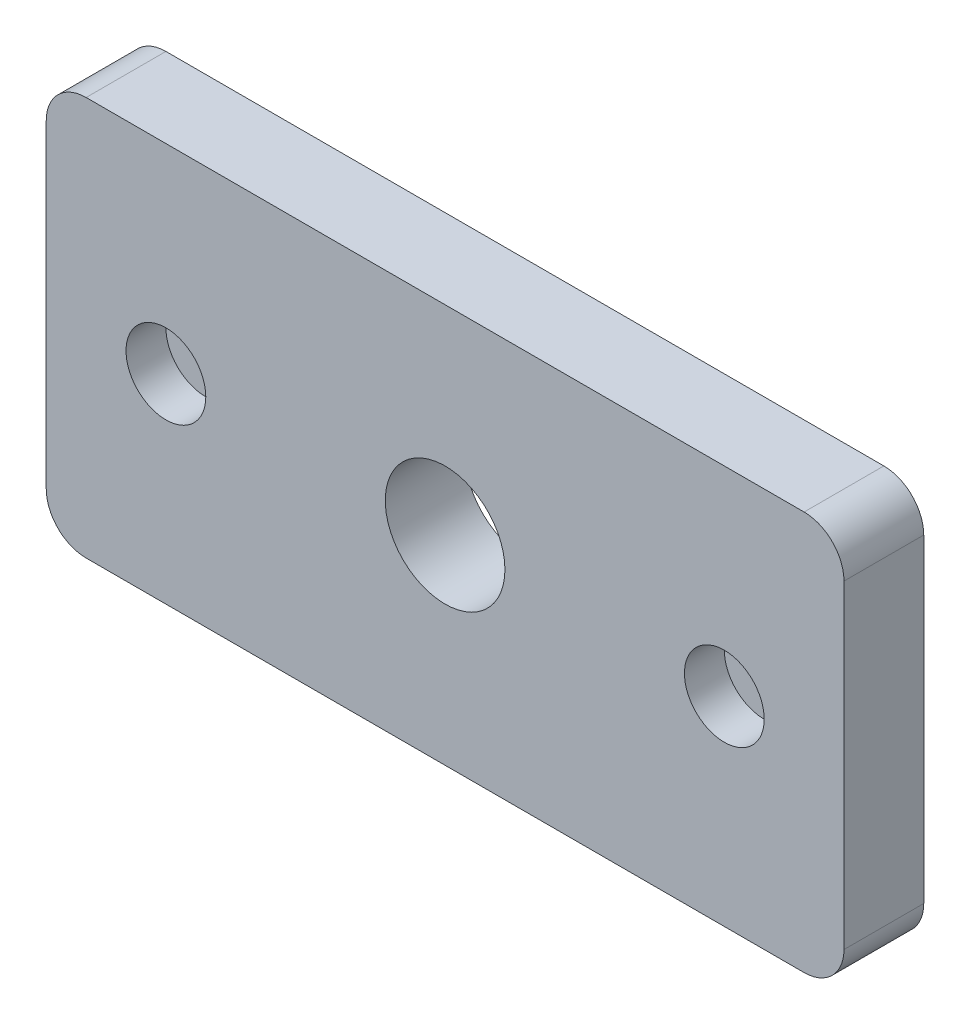
ISO-10303-21;
HEADER;
FILE_DESCRIPTION(('STEP AP214'),'2;1');
FILE_NAME('part.step','',(''),(''),'','','');
FILE_SCHEMA(('AUTOMOTIVE_DESIGN { 1 0 10303 214 1 1 1 1 }'));
ENDSEC;
DATA;
#1=APPLICATION_CONTEXT('core data for automotive mechanical design processes');
#2=APPLICATION_PROTOCOL_DEFINITION('international standard','automotive_design',2000,#1);
#3=PRODUCT_CONTEXT('',#1,'mechanical');
#4=PRODUCT('Part','Part','',(#3));
#5=PRODUCT_RELATED_PRODUCT_CATEGORY('part','',(#4));
#6=PRODUCT_DEFINITION_FORMATION('','',#4);
#7=PRODUCT_DEFINITION_CONTEXT('part definition',#1,'design');
#8=PRODUCT_DEFINITION('design','',#6,#7);
#9=PRODUCT_DEFINITION_SHAPE('','',#8);
#10=(LENGTH_UNIT() NAMED_UNIT(*) SI_UNIT(.MILLI.,.METRE.));
#11=(NAMED_UNIT(*) PLANE_ANGLE_UNIT() SI_UNIT($,.RADIAN.));
#12=(NAMED_UNIT(*) SI_UNIT($,.STERADIAN.) SOLID_ANGLE_UNIT());
#13=UNCERTAINTY_MEASURE_WITH_UNIT(LENGTH_MEASURE(1.E-05),#10,'distance_accuracy_value','');
#14=(GEOMETRIC_REPRESENTATION_CONTEXT(3) GLOBAL_UNCERTAINTY_ASSIGNED_CONTEXT((#13)) GLOBAL_UNIT_ASSIGNED_CONTEXT((#10,
#11,#12)) REPRESENTATION_CONTEXT('',''));
#15=CARTESIAN_POINT('',(0.,0.,0.));
#16=DIRECTION('',(0.,0.,1.));
#17=DIRECTION('',(1.,0.,0.));
#18=AXIS2_PLACEMENT_3D('',#15,#16,#17);
#19=CARTESIAN_POINT('',(5000.,-2500.,1000.));
#20=DIRECTION('',(-1.,0.,0.));
#21=DIRECTION('',(0.,0.,1.));
#22=AXIS2_PLACEMENT_3D('',#19,#20,#21);
#23=PLANE('',#22);
#24=DIRECTION('',(0.,1.,0.));
#25=VECTOR('',#24,1.);
#26=CARTESIAN_POINT('',(5000.,-2500.,1000.));
#27=LINE('',#26,#25);
#28=CARTESIAN_POINT('',(5000.,-2000.,1000.));
#29=VERTEX_POINT('',#28);
#30=CARTESIAN_POINT('',(5000.,2000.,1000.));
#31=VERTEX_POINT('',#30);
#32=EDGE_CURVE('E128',#29,#31,#27,.T.);
#33=ORIENTED_EDGE('',*,*,#32,.F.);
#34=DIRECTION('',(0.,0.,-1.));
#35=VECTOR('',#34,1.);
#36=CARTESIAN_POINT('',(5000.,-2000.,1000.));
#37=LINE('',#36,#35);
#38=CARTESIAN_POINT('',(5000.,-2000.,0.));
#39=VERTEX_POINT('',#38);
#40=EDGE_CURVE('E40',#29,#39,#37,.T.);
#41=ORIENTED_EDGE('',*,*,#40,.T.);
#42=DIRECTION('',(0.,1.,0.));
#43=VECTOR('',#42,1.);
#44=CARTESIAN_POINT('',(5000.,-2500.,0.));
#45=LINE('',#44,#43);
#46=CARTESIAN_POINT('',(5000.,2000.,0.));
#47=VERTEX_POINT('',#46);
#48=EDGE_CURVE('E130',#39,#47,#45,.T.);
#49=ORIENTED_EDGE('',*,*,#48,.T.);
#50=DIRECTION('',(0.,0.,-1.));
#51=VECTOR('',#50,1.);
#52=CARTESIAN_POINT('',(5000.,2000.,1000.));
#53=LINE('',#52,#51);
#54=EDGE_CURVE('E47',#47,#31,#53,.F.);
#55=ORIENTED_EDGE('',*,*,#54,.T.);
#56=EDGE_LOOP('',(#33,#41,#49,#55));
#57=FACE_BOUND('',#56,.T.);
#58=ADVANCED_FACE('F32',(#57),#23,.F.);
#59=CARTESIAN_POINT('',(-5000.,2500.,1000.));
#60=DIRECTION('',(0.,-1.,0.));
#61=DIRECTION('',(0.,0.,-1.));
#62=AXIS2_PLACEMENT_3D('',#59,#60,#61);
#63=PLANE('',#62);
#64=DIRECTION('',(-1.,0.,0.));
#65=VECTOR('',#64,1.);
#66=CARTESIAN_POINT('',(-5000.,2500.,1000.));
#67=LINE('',#66,#65);
#68=CARTESIAN_POINT('',(4500.,2500.,1000.));
#69=VERTEX_POINT('',#68);
#70=CARTESIAN_POINT('',(-4500.,2500.,1000.));
#71=VERTEX_POINT('',#70);
#72=EDGE_CURVE('E165',#69,#71,#67,.T.);
#73=ORIENTED_EDGE('',*,*,#72,.F.);
#74=DIRECTION('',(0.,0.,-1.));
#75=VECTOR('',#74,1.);
#76=CARTESIAN_POINT('',(4500.,2500.,1000.));
#77=LINE('',#76,#75);
#78=CARTESIAN_POINT('',(4500.,2500.,0.));
#79=VERTEX_POINT('',#78);
#80=EDGE_CURVE('E11',#69,#79,#77,.T.);
#81=ORIENTED_EDGE('',*,*,#80,.T.);
#82=DIRECTION('',(-1.,0.,0.));
#83=VECTOR('',#82,1.);
#84=CARTESIAN_POINT('',(-5000.,2500.,0.));
#85=LINE('',#84,#83);
#86=CARTESIAN_POINT('',(-4500.,2500.,0.));
#87=VERTEX_POINT('',#86);
#88=EDGE_CURVE('E125',#79,#87,#85,.T.);
#89=ORIENTED_EDGE('',*,*,#88,.T.);
#90=DIRECTION('',(0.,0.,-1.));
#91=VECTOR('',#90,1.);
#92=CARTESIAN_POINT('',(-4500.,2500.,1000.));
#93=LINE('',#92,#91);
#94=EDGE_CURVE('E106',#87,#71,#93,.F.);
#95=ORIENTED_EDGE('',*,*,#94,.T.);
#96=EDGE_LOOP('',(#73,#81,#89,#95));
#97=FACE_BOUND('',#96,.T.);
#98=ADVANCED_FACE('F216',(#97),#63,.F.);
#99=CARTESIAN_POINT('',(-5000.,-2500.,1000.));
#100=DIRECTION('',(1.,0.,0.));
#101=DIRECTION('',(0.,0.,-1.));
#102=AXIS2_PLACEMENT_3D('',#99,#100,#101);
#103=PLANE('',#102);
#104=DIRECTION('',(0.,-1.,0.));
#105=VECTOR('',#104,1.);
#106=CARTESIAN_POINT('',(-5000.,-2500.,0.));
#107=LINE('',#106,#105);
#108=CARTESIAN_POINT('',(-5000.,2000.,0.));
#109=VERTEX_POINT('',#108);
#110=CARTESIAN_POINT('',(-5000.,-2000.,0.));
#111=VERTEX_POINT('',#110);
#112=EDGE_CURVE('E115',#109,#111,#107,.T.);
#113=ORIENTED_EDGE('',*,*,#112,.T.);
#114=DIRECTION('',(0.,0.,-1.));
#115=VECTOR('',#114,1.);
#116=CARTESIAN_POINT('',(-5000.,-2000.,1000.));
#117=LINE('',#116,#115);
#118=CARTESIAN_POINT('',(-5000.,-2000.,1000.));
#119=VERTEX_POINT('',#118);
#120=EDGE_CURVE('E147',#111,#119,#117,.F.);
#121=ORIENTED_EDGE('',*,*,#120,.T.);
#122=DIRECTION('',(0.,-1.,0.));
#123=VECTOR('',#122,1.);
#124=CARTESIAN_POINT('',(-5000.,-2500.,1000.));
#125=LINE('',#124,#123);
#126=CARTESIAN_POINT('',(-5000.,2000.,1000.));
#127=VERTEX_POINT('',#126);
#128=EDGE_CURVE('E118',#127,#119,#125,.T.);
#129=ORIENTED_EDGE('',*,*,#128,.F.);
#130=DIRECTION('',(0.,0.,-1.));
#131=VECTOR('',#130,1.);
#132=CARTESIAN_POINT('',(-5000.,2000.,1000.));
#133=LINE('',#132,#131);
#134=EDGE_CURVE('E104',#127,#109,#133,.T.);
#135=ORIENTED_EDGE('',*,*,#134,.T.);
#136=EDGE_LOOP('',(#113,#121,#129,#135));
#137=FACE_BOUND('',#136,.T.);
#138=ADVANCED_FACE('F114',(#137),#103,.F.);
#139=CARTESIAN_POINT('',(-5000.,-2500.,1000.));
#140=DIRECTION('',(0.,1.,0.));
#141=DIRECTION('',(0.,0.,1.));
#142=AXIS2_PLACEMENT_3D('',#139,#140,#141);
#143=PLANE('',#142);
#144=DIRECTION('',(1.,0.,0.));
#145=VECTOR('',#144,1.);
#146=CARTESIAN_POINT('',(-5000.,-2500.,1000.));
#147=LINE('',#146,#145);
#148=CARTESIAN_POINT('',(-4500.,-2500.,1000.));
#149=VERTEX_POINT('',#148);
#150=CARTESIAN_POINT('',(4500.,-2500.,1000.));
#151=VERTEX_POINT('',#150);
#152=EDGE_CURVE('E119',#149,#151,#147,.T.);
#153=ORIENTED_EDGE('',*,*,#152,.F.);
#154=DIRECTION('',(0.,0.,-1.));
#155=VECTOR('',#154,1.);
#156=CARTESIAN_POINT('',(-4500.,-2500.,1000.));
#157=LINE('',#156,#155);
#158=CARTESIAN_POINT('',(-4500.,-2500.,0.));
#159=VERTEX_POINT('',#158);
#160=EDGE_CURVE('E139',#149,#159,#157,.T.);
#161=ORIENTED_EDGE('',*,*,#160,.T.);
#162=DIRECTION('',(1.,0.,0.));
#163=VECTOR('',#162,1.);
#164=CARTESIAN_POINT('',(-5000.,-2500.,0.));
#165=LINE('',#164,#163);
#166=CARTESIAN_POINT('',(4500.,-2500.,0.));
#167=VERTEX_POINT('',#166);
#168=EDGE_CURVE('E124',#159,#167,#165,.T.);
#169=ORIENTED_EDGE('',*,*,#168,.T.);
#170=DIRECTION('',(0.,0.,-1.));
#171=VECTOR('',#170,1.);
#172=CARTESIAN_POINT('',(4500.,-2500.,1000.));
#173=LINE('',#172,#171);
#174=EDGE_CURVE('E137',#167,#151,#173,.F.);
#175=ORIENTED_EDGE('',*,*,#174,.T.);
#176=EDGE_LOOP('',(#153,#161,#169,#175));
#177=FACE_BOUND('',#176,.T.);
#178=ADVANCED_FACE('F194',(#177),#143,.F.);
#179=CARTESIAN_POINT('',(0.,0.,1000.));
#180=DIRECTION('',(0.,0.,-1.));
#181=DIRECTION('',(-1.,0.,0.));
#182=AXIS2_PLACEMENT_3D('',#179,#180,#181);
#183=PLANE('',#182);
#184=CARTESIAN_POINT('',(0.,0.,1000.));
#185=DIRECTION('',(0.,0.,1.));
#186=DIRECTION('',(1.,0.,0.));
#187=AXIS2_PLACEMENT_3D('',#184,#185,#186);
#188=CIRCLE('',#187,750.);
#189=CARTESIAN_POINT('',(750.,0.,1000.));
#190=VERTEX_POINT('',#189);
#191=EDGE_CURVE('E177',#190,#190,#188,.T.);
#192=ORIENTED_EDGE('',*,*,#191,.F.);
#193=EDGE_LOOP('',(#192));
#194=FACE_BOUND('',#193,.T.);
#195=CARTESIAN_POINT('',(3500.,0.,1000.));
#196=DIRECTION('',(0.,0.,1.));
#197=DIRECTION('',(1.,0.,0.));
#198=AXIS2_PLACEMENT_3D('',#195,#196,#197);
#199=CIRCLE('',#198,500.);
#200=CARTESIAN_POINT('',(4000.,0.,1000.));
#201=VERTEX_POINT('',#200);
#202=EDGE_CURVE('E171',#201,#201,#199,.T.);
#203=ORIENTED_EDGE('',*,*,#202,.F.);
#204=EDGE_LOOP('',(#203));
#205=FACE_BOUND('',#204,.T.);
#206=CARTESIAN_POINT('',(-3500.,0.,1000.));
#207=DIRECTION('',(0.,0.,1.));
#208=DIRECTION('',(1.,0.,0.));
#209=AXIS2_PLACEMENT_3D('',#206,#207,#208);
#210=CIRCLE('',#209,500.);
#211=CARTESIAN_POINT('',(-3000.,0.,1000.));
#212=VERTEX_POINT('',#211);
#213=EDGE_CURVE('E160',#212,#212,#210,.T.);
#214=ORIENTED_EDGE('',*,*,#213,.F.);
#215=EDGE_LOOP('',(#214));
#216=FACE_BOUND('',#215,.T.);
#217=ORIENTED_EDGE('',*,*,#128,.T.);
#218=CARTESIAN_POINT('',(-4500.,-2000.,1000.));
#219=DIRECTION('',(0.,0.,-1.));
#220=DIRECTION('',(-1.,0.,0.));
#221=AXIS2_PLACEMENT_3D('',#218,#219,#220);
#222=CIRCLE('',#221,500.);
#223=EDGE_CURVE('E152',#119,#149,#222,.F.);
#224=ORIENTED_EDGE('',*,*,#223,.T.);
#225=ORIENTED_EDGE('',*,*,#152,.T.);
#226=CARTESIAN_POINT('',(4500.,-2000.,1000.));
#227=DIRECTION('',(0.,0.,-1.));
#228=DIRECTION('',(-1.,0.,0.));
#229=AXIS2_PLACEMENT_3D('',#226,#227,#228);
#230=CIRCLE('',#229,500.);
#231=EDGE_CURVE('E54',#151,#29,#230,.F.);
#232=ORIENTED_EDGE('',*,*,#231,.T.);
#233=ORIENTED_EDGE('',*,*,#32,.T.);
#234=CARTESIAN_POINT('',(4500.,2000.,1000.));
#235=DIRECTION('',(0.,0.,-1.));
#236=DIRECTION('',(-1.,0.,0.));
#237=AXIS2_PLACEMENT_3D('',#234,#235,#236);
#238=CIRCLE('',#237,500.);
#239=EDGE_CURVE('E149',#31,#69,#238,.F.);
#240=ORIENTED_EDGE('',*,*,#239,.T.);
#241=ORIENTED_EDGE('',*,*,#72,.T.);
#242=CARTESIAN_POINT('',(-4500.,2000.,1000.));
#243=DIRECTION('',(0.,0.,-1.));
#244=DIRECTION('',(-1.,0.,0.));
#245=AXIS2_PLACEMENT_3D('',#242,#243,#244);
#246=CIRCLE('',#245,500.);
#247=EDGE_CURVE('E135',#71,#127,#246,.F.);
#248=ORIENTED_EDGE('',*,*,#247,.T.);
#249=EDGE_LOOP('',(#217,#224,#225,#232,#233,#240,#241,#248));
#250=FACE_BOUND('',#249,.T.);
#251=ADVANCED_FACE('F191',(#194,#205,#216,#250),#183,.F.);
#252=CARTESIAN_POINT('',(0.,0.,0.));
#253=DIRECTION('',(0.,0.,-1.));
#254=DIRECTION('',(-1.,0.,0.));
#255=AXIS2_PLACEMENT_3D('',#252,#253,#254);
#256=PLANE('',#255);
#257=CARTESIAN_POINT('',(0.,0.,0.));
#258=DIRECTION('',(0.,0.,1.));
#259=DIRECTION('',(1.,0.,0.));
#260=AXIS2_PLACEMENT_3D('',#257,#258,#259);
#261=CIRCLE('',#260,750.);
#262=CARTESIAN_POINT('',(750.,0.,0.));
#263=VERTEX_POINT('',#262);
#264=EDGE_CURVE('E174',#263,#263,#261,.T.);
#265=ORIENTED_EDGE('',*,*,#264,.T.);
#266=EDGE_LOOP('',(#265));
#267=FACE_BOUND('',#266,.T.);
#268=ORIENTED_EDGE('',*,*,#168,.F.);
#269=CARTESIAN_POINT('',(-4500.,-2000.,0.));
#270=DIRECTION('',(0.,0.,-1.));
#271=DIRECTION('',(-1.,0.,0.));
#272=AXIS2_PLACEMENT_3D('',#269,#270,#271);
#273=CIRCLE('',#272,500.);
#274=EDGE_CURVE('E123',#159,#111,#273,.T.);
#275=ORIENTED_EDGE('',*,*,#274,.T.);
#276=ORIENTED_EDGE('',*,*,#112,.F.);
#277=CARTESIAN_POINT('',(-4500.,2000.,0.));
#278=DIRECTION('',(0.,0.,-1.));
#279=DIRECTION('',(-1.,0.,0.));
#280=AXIS2_PLACEMENT_3D('',#277,#278,#279);
#281=CIRCLE('',#280,500.);
#282=EDGE_CURVE('E100',#109,#87,#281,.T.);
#283=ORIENTED_EDGE('',*,*,#282,.T.);
#284=ORIENTED_EDGE('',*,*,#88,.F.);
#285=CARTESIAN_POINT('',(4500.,2000.,0.));
#286=DIRECTION('',(0.,0.,-1.));
#287=DIRECTION('',(-1.,0.,0.));
#288=AXIS2_PLACEMENT_3D('',#285,#286,#287);
#289=CIRCLE('',#288,500.);
#290=EDGE_CURVE('E142',#79,#47,#289,.T.);
#291=ORIENTED_EDGE('',*,*,#290,.T.);
#292=ORIENTED_EDGE('',*,*,#48,.F.);
#293=CARTESIAN_POINT('',(4500.,-2000.,0.));
#294=DIRECTION('',(0.,0.,-1.));
#295=DIRECTION('',(-1.,0.,0.));
#296=AXIS2_PLACEMENT_3D('',#293,#294,#295);
#297=CIRCLE('',#296,500.);
#298=EDGE_CURVE('E144',#39,#167,#297,.T.);
#299=ORIENTED_EDGE('',*,*,#298,.T.);
#300=EDGE_LOOP('',(#268,#275,#276,#283,#284,#291,#292,#299));
#301=FACE_BOUND('',#300,.T.);
#302=ADVANCED_FACE('F122',(#267,#301),#256,.T.);
#303=CARTESIAN_POINT('',(-4500.,2000.,1000.));
#304=DIRECTION('',(0.,0.,-1.));
#305=DIRECTION('',(-1.,0.,0.));
#306=AXIS2_PLACEMENT_3D('',#303,#304,#305);
#307=CYLINDRICAL_SURFACE('',#306,500.);
#308=ORIENTED_EDGE('',*,*,#247,.F.);
#309=ORIENTED_EDGE('',*,*,#94,.F.);
#310=ORIENTED_EDGE('',*,*,#282,.F.);
#311=ORIENTED_EDGE('',*,*,#134,.F.);
#312=EDGE_LOOP('',(#308,#309,#310,#311));
#313=FACE_BOUND('',#312,.T.);
#314=ADVANCED_FACE('F103',(#313),#307,.T.);
#315=CARTESIAN_POINT('',(-4500.,-2000.,1000.));
#316=DIRECTION('',(0.,0.,-1.));
#317=DIRECTION('',(-1.,0.,0.));
#318=AXIS2_PLACEMENT_3D('',#315,#316,#317);
#319=CYLINDRICAL_SURFACE('',#318,500.);
#320=ORIENTED_EDGE('',*,*,#223,.F.);
#321=ORIENTED_EDGE('',*,*,#120,.F.);
#322=ORIENTED_EDGE('',*,*,#274,.F.);
#323=ORIENTED_EDGE('',*,*,#160,.F.);
#324=EDGE_LOOP('',(#320,#321,#322,#323));
#325=FACE_BOUND('',#324,.T.);
#326=ADVANCED_FACE('F203',(#325),#319,.T.);
#327=CARTESIAN_POINT('',(4500.,-2000.,1000.));
#328=DIRECTION('',(0.,0.,-1.));
#329=DIRECTION('',(-1.,0.,0.));
#330=AXIS2_PLACEMENT_3D('',#327,#328,#329);
#331=CYLINDRICAL_SURFACE('',#330,500.);
#332=ORIENTED_EDGE('',*,*,#231,.F.);
#333=ORIENTED_EDGE('',*,*,#174,.F.);
#334=ORIENTED_EDGE('',*,*,#298,.F.);
#335=ORIENTED_EDGE('',*,*,#40,.F.);
#336=EDGE_LOOP('',(#332,#333,#334,#335));
#337=FACE_BOUND('',#336,.T.);
#338=ADVANCED_FACE('F206',(#337),#331,.T.);
#339=CARTESIAN_POINT('',(4500.,2000.,1000.));
#340=DIRECTION('',(0.,0.,-1.));
#341=DIRECTION('',(-1.,0.,0.));
#342=AXIS2_PLACEMENT_3D('',#339,#340,#341);
#343=CYLINDRICAL_SURFACE('',#342,500.);
#344=ORIENTED_EDGE('',*,*,#239,.F.);
#345=ORIENTED_EDGE('',*,*,#54,.F.);
#346=ORIENTED_EDGE('',*,*,#290,.F.);
#347=ORIENTED_EDGE('',*,*,#80,.F.);
#348=EDGE_LOOP('',(#344,#345,#346,#347));
#349=FACE_BOUND('',#348,.T.);
#350=ADVANCED_FACE('F34',(#349),#343,.T.);
#351=CARTESIAN_POINT('',(-3500.,0.,500.));
#352=DIRECTION('',(0.,0.,1.));
#353=DIRECTION('',(1.,0.,0.));
#354=AXIS2_PLACEMENT_3D('',#351,#352,#353);
#355=CYLINDRICAL_SURFACE('',#354,500.);
#356=CARTESIAN_POINT('',(-3500.,0.,500.));
#357=DIRECTION('',(0.,0.,1.));
#358=DIRECTION('',(1.,0.,0.));
#359=AXIS2_PLACEMENT_3D('',#356,#357,#358);
#360=CIRCLE('',#359,500.);
#361=CARTESIAN_POINT('',(-3000.,0.,500.));
#362=VERTEX_POINT('',#361);
#363=EDGE_CURVE('E158',#362,#362,#360,.T.);
#364=ORIENTED_EDGE('',*,*,#363,.F.);
#365=EDGE_LOOP('',(#364));
#366=FACE_BOUND('',#365,.T.);
#367=ORIENTED_EDGE('',*,*,#213,.T.);
#368=EDGE_LOOP('',(#367));
#369=FACE_BOUND('',#368,.T.);
#370=ADVANCED_FACE('F212',(#366,#369),#355,.F.);
#371=CARTESIAN_POINT('',(-3500.,0.,500.));
#372=DIRECTION('',(0.,0.,1.));
#373=DIRECTION('',(1.,0.,0.));
#374=AXIS2_PLACEMENT_3D('',#371,#372,#373);
#375=PLANE('',#374);
#376=ORIENTED_EDGE('',*,*,#363,.T.);
#377=EDGE_LOOP('',(#376));
#378=FACE_BOUND('',#377,.T.);
#379=ADVANCED_FACE('F276',(#378),#375,.T.);
#380=CARTESIAN_POINT('',(3500.,0.,500.));
#381=DIRECTION('',(0.,0.,1.));
#382=DIRECTION('',(1.,0.,0.));
#383=AXIS2_PLACEMENT_3D('',#380,#381,#382);
#384=CYLINDRICAL_SURFACE('',#383,500.);
#385=CARTESIAN_POINT('',(3500.,0.,500.));
#386=DIRECTION('',(0.,0.,1.));
#387=DIRECTION('',(1.,0.,0.));
#388=AXIS2_PLACEMENT_3D('',#385,#386,#387);
#389=CIRCLE('',#388,500.);
#390=CARTESIAN_POINT('',(4000.,0.,500.));
#391=VERTEX_POINT('',#390);
#392=EDGE_CURVE('E169',#391,#391,#389,.T.);
#393=ORIENTED_EDGE('',*,*,#392,.F.);
#394=EDGE_LOOP('',(#393));
#395=FACE_BOUND('',#394,.T.);
#396=ORIENTED_EDGE('',*,*,#202,.T.);
#397=EDGE_LOOP('',(#396));
#398=FACE_BOUND('',#397,.T.);
#399=ADVANCED_FACE('F271',(#395,#398),#384,.F.);
#400=CARTESIAN_POINT('',(3500.,0.,500.));
#401=DIRECTION('',(0.,0.,1.));
#402=DIRECTION('',(1.,0.,0.));
#403=AXIS2_PLACEMENT_3D('',#400,#401,#402);
#404=PLANE('',#403);
#405=ORIENTED_EDGE('',*,*,#392,.T.);
#406=EDGE_LOOP('',(#405));
#407=FACE_BOUND('',#406,.T.);
#408=ADVANCED_FACE('F187',(#407),#404,.T.);
#409=CARTESIAN_POINT('',(0.,0.,0.));
#410=DIRECTION('',(0.,0.,1.));
#411=DIRECTION('',(1.,0.,0.));
#412=AXIS2_PLACEMENT_3D('',#409,#410,#411);
#413=CYLINDRICAL_SURFACE('',#412,750.);
#414=ORIENTED_EDGE('',*,*,#264,.F.);
#415=EDGE_LOOP('',(#414));
#416=FACE_BOUND('',#415,.T.);
#417=ORIENTED_EDGE('',*,*,#191,.T.);
#418=EDGE_LOOP('',(#417));
#419=FACE_BOUND('',#418,.T.);
#420=ADVANCED_FACE('F184',(#416,#419),#413,.F.);
#421=CLOSED_SHELL('',(#58,#98,#138,#178,#251,#302,#314,#326,#338,#350,#370,#379,#399,#408,#420));
#422=MANIFOLD_SOLID_BREP('B2',#421);
#423=ADVANCED_BREP_SHAPE_REPRESENTATION('',(#18,#422),#14);
#424=SHAPE_DEFINITION_REPRESENTATION(#9,#423);
ENDSEC;
END-ISO-10303-21;
